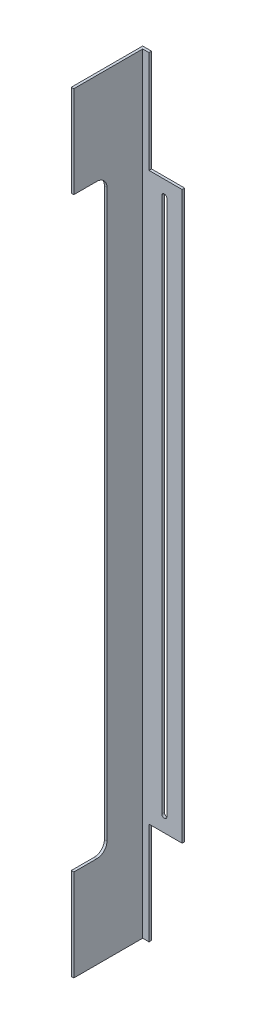
ISO-10303-21;
HEADER;
FILE_DESCRIPTION(('STEP AP214'),'2;1');
FILE_NAME('part.step','',(''),(''),'','','');
FILE_SCHEMA(('AUTOMOTIVE_DESIGN { 1 0 10303 214 1 1 1 1 }'));
ENDSEC;
DATA;
#1=APPLICATION_CONTEXT('core data for automotive mechanical design processes');
#2=APPLICATION_PROTOCOL_DEFINITION('international standard','automotive_design',2000,#1);
#3=PRODUCT_CONTEXT('',#1,'mechanical');
#4=PRODUCT('Part','Part','',(#3));
#5=PRODUCT_RELATED_PRODUCT_CATEGORY('part','',(#4));
#6=PRODUCT_DEFINITION_FORMATION('','',#4);
#7=PRODUCT_DEFINITION_CONTEXT('part definition',#1,'design');
#8=PRODUCT_DEFINITION('design','',#6,#7);
#9=PRODUCT_DEFINITION_SHAPE('','',#8);
#10=(LENGTH_UNIT() NAMED_UNIT(*) SI_UNIT(.MILLI.,.METRE.));
#11=(NAMED_UNIT(*) PLANE_ANGLE_UNIT() SI_UNIT($,.RADIAN.));
#12=(NAMED_UNIT(*) SI_UNIT($,.STERADIAN.) SOLID_ANGLE_UNIT());
#13=UNCERTAINTY_MEASURE_WITH_UNIT(LENGTH_MEASURE(1.E-05),#10,'distance_accuracy_value','');
#14=(GEOMETRIC_REPRESENTATION_CONTEXT(3) GLOBAL_UNCERTAINTY_ASSIGNED_CONTEXT((#13)) GLOBAL_UNIT_ASSIGNED_CONTEXT((#10,
#11,#12)) REPRESENTATION_CONTEXT('',''));
#15=CARTESIAN_POINT('',(0.,0.,0.));
#16=DIRECTION('',(0.,0.,1.));
#17=DIRECTION('',(1.,0.,0.));
#18=AXIS2_PLACEMENT_3D('',#15,#16,#17);
#19=CARTESIAN_POINT('',(3.50000000000001,262.,1.));
#20=DIRECTION('',(0.,0.,1.));
#21=DIRECTION('',(1.,0.,0.));
#22=AXIS2_PLACEMENT_3D('',#19,#20,#21);
#23=PLANE('',#22);
#24=DIRECTION('',(0.,1.,0.));
#25=VECTOR('',#24,1.);
#26=CARTESIAN_POINT('',(1.00000000000002,262.,1.));
#27=LINE('',#26,#25);
#28=CARTESIAN_POINT('',(0.999999999999997,-40.,1.));
#29=VERTEX_POINT('',#28);
#30=CARTESIAN_POINT('',(1.00000000000002,262.,1.));
#31=VERTEX_POINT('',#30);
#32=EDGE_CURVE('E234',#29,#31,#27,.T.);
#33=ORIENTED_EDGE('',*,*,#32,.F.);
#34=DIRECTION('',(1.,0.,0.));
#35=VECTOR('',#34,1.);
#36=CARTESIAN_POINT('',(3.50000000000001,-40.,1.));
#37=LINE('',#36,#35);
#38=CARTESIAN_POINT('',(3.50000000000001,-40.,1.));
#39=VERTEX_POINT('',#38);
#40=EDGE_CURVE('E189',#29,#39,#37,.T.);
#41=ORIENTED_EDGE('',*,*,#40,.T.);
#42=DIRECTION('',(0.,1.,0.));
#43=VECTOR('',#42,1.);
#44=CARTESIAN_POINT('',(3.5,0.,1.));
#45=LINE('',#44,#43);
#46=CARTESIAN_POINT('',(3.5,0.,1.));
#47=VERTEX_POINT('',#46);
#48=EDGE_CURVE('E262',#39,#47,#45,.T.);
#49=ORIENTED_EDGE('',*,*,#48,.T.);
#50=DIRECTION('',(1.,0.,0.));
#51=VECTOR('',#50,1.);
#52=CARTESIAN_POINT('',(3.5,0.,1.));
#53=LINE('',#52,#51);
#54=CARTESIAN_POINT('',(16.5,0.,1.));
#55=VERTEX_POINT('',#54);
#56=EDGE_CURVE('E264',#47,#55,#53,.T.);
#57=ORIENTED_EDGE('',*,*,#56,.T.);
#58=DIRECTION('',(0.,1.,0.));
#59=VECTOR('',#58,1.);
#60=CARTESIAN_POINT('',(16.5,0.,1.));
#61=LINE('',#60,#59);
#62=CARTESIAN_POINT('',(16.5,222.,1.));
#63=VERTEX_POINT('',#62);
#64=EDGE_CURVE('E266',#55,#63,#61,.T.);
#65=ORIENTED_EDGE('',*,*,#64,.T.);
#66=DIRECTION('',(-1.,0.,0.));
#67=VECTOR('',#66,1.);
#68=CARTESIAN_POINT('',(3.5,222.,1.));
#69=LINE('',#68,#67);
#70=CARTESIAN_POINT('',(3.5,222.,1.));
#71=VERTEX_POINT('',#70);
#72=EDGE_CURVE('E268',#63,#71,#69,.T.);
#73=ORIENTED_EDGE('',*,*,#72,.T.);
#74=DIRECTION('',(0.,1.,0.));
#75=VECTOR('',#74,1.);
#76=CARTESIAN_POINT('',(3.5,222.,1.));
#77=LINE('',#76,#75);
#78=CARTESIAN_POINT('',(3.50000000000001,262.,1.));
#79=VERTEX_POINT('',#78);
#80=EDGE_CURVE('E255',#71,#79,#77,.T.);
#81=ORIENTED_EDGE('',*,*,#80,.T.);
#82=DIRECTION('',(-1.,0.,0.));
#83=VECTOR('',#82,1.);
#84=CARTESIAN_POINT('',(3.50000000000001,262.,1.));
#85=LINE('',#84,#83);
#86=EDGE_CURVE('E258',#79,#31,#85,.T.);
#87=ORIENTED_EDGE('',*,*,#86,.T.);
#88=EDGE_LOOP('',(#33,#41,#49,#57,#65,#73,#81,#87));
#89=FACE_BOUND('',#88,.T.);
#90=DIRECTION('',(0.,-1.,0.));
#91=VECTOR('',#90,1.);
#92=CARTESIAN_POINT('',(8.5,217.,1.));
#93=LINE('',#92,#91);
#94=CARTESIAN_POINT('',(8.5,216.,1.));
#95=VERTEX_POINT('',#94);
#96=CARTESIAN_POINT('',(8.50000000000003,6.00000000000001,1.));
#97=VERTEX_POINT('',#96);
#98=EDGE_CURVE('E244',#95,#97,#93,.T.);
#99=ORIENTED_EDGE('',*,*,#98,.F.);
#100=CARTESIAN_POINT('',(9.5,216.,1.));
#101=DIRECTION('',(0.,0.,1.));
#102=DIRECTION('',(1.,0.,0.));
#103=AXIS2_PLACEMENT_3D('',#100,#101,#102);
#104=CIRCLE('',#103,1.);
#105=CARTESIAN_POINT('',(9.5,217.,1.));
#106=VERTEX_POINT('',#105);
#107=EDGE_CURVE('E332',#95,#106,#104,.F.);
#108=ORIENTED_EDGE('',*,*,#107,.T.);
#109=CARTESIAN_POINT('',(9.5,216.,1.));
#110=DIRECTION('',(0.,0.,1.));
#111=DIRECTION('',(1.,0.,0.));
#112=AXIS2_PLACEMENT_3D('',#109,#110,#111);
#113=CIRCLE('',#112,1.);
#114=CARTESIAN_POINT('',(10.5,216.,1.));
#115=VERTEX_POINT('',#114);
#116=EDGE_CURVE('E328',#106,#115,#113,.F.);
#117=ORIENTED_EDGE('',*,*,#116,.T.);
#118=DIRECTION('',(0.,1.,0.));
#119=VECTOR('',#118,1.);
#120=CARTESIAN_POINT('',(10.5,217.,1.));
#121=LINE('',#120,#119);
#122=CARTESIAN_POINT('',(10.5,6.00000000000001,1.));
#123=VERTEX_POINT('',#122);
#124=EDGE_CURVE('E241',#123,#115,#121,.T.);
#125=ORIENTED_EDGE('',*,*,#124,.F.);
#126=CARTESIAN_POINT('',(9.50000000000003,6.00000000000001,1.));
#127=DIRECTION('',(0.,0.,1.));
#128=DIRECTION('',(1.,0.,0.));
#129=AXIS2_PLACEMENT_3D('',#126,#127,#128);
#130=CIRCLE('',#129,1.);
#131=CARTESIAN_POINT('',(9.50000000000003,5.00000000000001,1.));
#132=VERTEX_POINT('',#131);
#133=EDGE_CURVE('E324',#123,#132,#130,.F.);
#134=ORIENTED_EDGE('',*,*,#133,.T.);
#135=CARTESIAN_POINT('',(9.50000000000003,6.00000000000001,1.));
#136=DIRECTION('',(0.,0.,1.));
#137=DIRECTION('',(1.,0.,0.));
#138=AXIS2_PLACEMENT_3D('',#135,#136,#137);
#139=CIRCLE('',#138,1.);
#140=EDGE_CURVE('E320',#132,#97,#139,.F.);
#141=ORIENTED_EDGE('',*,*,#140,.T.);
#142=EDGE_LOOP('',(#99,#108,#117,#125,#134,#141));
#143=FACE_BOUND('',#142,.T.);
#144=ADVANCED_FACE('F34',(#89,#143),#23,.T.);
#145=CARTESIAN_POINT('',(3.50000000000001,262.,0.));
#146=DIRECTION('',(0.,0.,1.));
#147=DIRECTION('',(1.,0.,0.));
#148=AXIS2_PLACEMENT_3D('',#145,#146,#147);
#149=PLANE('',#148);
#150=DIRECTION('',(0.,1.,0.));
#151=VECTOR('',#150,1.);
#152=CARTESIAN_POINT('',(3.5,0.,0.));
#153=LINE('',#152,#151);
#154=CARTESIAN_POINT('',(3.50000000000001,-40.,0.));
#155=VERTEX_POINT('',#154);
#156=CARTESIAN_POINT('',(3.5,0.,0.));
#157=VERTEX_POINT('',#156);
#158=EDGE_CURVE('E279',#155,#157,#153,.T.);
#159=ORIENTED_EDGE('',*,*,#158,.F.);
#160=DIRECTION('',(1.,0.,0.));
#161=VECTOR('',#160,1.);
#162=CARTESIAN_POINT('',(3.50000000000001,-40.,0.));
#163=LINE('',#162,#161);
#164=CARTESIAN_POINT('',(0.,-40.,0.));
#165=VERTEX_POINT('',#164);
#166=EDGE_CURVE('E277',#165,#155,#163,.T.);
#167=ORIENTED_EDGE('',*,*,#166,.F.);
#168=DIRECTION('',(0.,-1.,0.));
#169=VECTOR('',#168,1.);
#170=CARTESIAN_POINT('',(0.,0.,0.));
#171=LINE('',#170,#169);
#172=CARTESIAN_POINT('',(0.,262.,0.));
#173=VERTEX_POINT('',#172);
#174=EDGE_CURVE('E275',#173,#165,#171,.T.);
#175=ORIENTED_EDGE('',*,*,#174,.F.);
#176=DIRECTION('',(-1.,0.,0.));
#177=VECTOR('',#176,1.);
#178=CARTESIAN_POINT('',(3.50000000000001,262.,0.));
#179=LINE('',#178,#177);
#180=CARTESIAN_POINT('',(3.50000000000001,262.,0.));
#181=VERTEX_POINT('',#180);
#182=EDGE_CURVE('E273',#181,#173,#179,.T.);
#183=ORIENTED_EDGE('',*,*,#182,.F.);
#184=DIRECTION('',(0.,1.,0.));
#185=VECTOR('',#184,1.);
#186=CARTESIAN_POINT('',(3.5,222.,0.));
#187=LINE('',#186,#185);
#188=CARTESIAN_POINT('',(3.5,222.,0.));
#189=VERTEX_POINT('',#188);
#190=EDGE_CURVE('E248',#189,#181,#187,.T.);
#191=ORIENTED_EDGE('',*,*,#190,.F.);
#192=DIRECTION('',(-1.,0.,0.));
#193=VECTOR('',#192,1.);
#194=CARTESIAN_POINT('',(3.5,222.,0.));
#195=LINE('',#194,#193);
#196=CARTESIAN_POINT('',(16.5,222.,0.));
#197=VERTEX_POINT('',#196);
#198=EDGE_CURVE('E259',#197,#189,#195,.T.);
#199=ORIENTED_EDGE('',*,*,#198,.F.);
#200=DIRECTION('',(0.,1.,0.));
#201=VECTOR('',#200,1.);
#202=CARTESIAN_POINT('',(16.5,0.,0.));
#203=LINE('',#202,#201);
#204=CARTESIAN_POINT('',(16.5,0.,0.));
#205=VERTEX_POINT('',#204);
#206=EDGE_CURVE('E283',#205,#197,#203,.T.);
#207=ORIENTED_EDGE('',*,*,#206,.F.);
#208=DIRECTION('',(1.,0.,0.));
#209=VECTOR('',#208,1.);
#210=CARTESIAN_POINT('',(3.5,0.,0.));
#211=LINE('',#210,#209);
#212=EDGE_CURVE('E281',#157,#205,#211,.T.);
#213=ORIENTED_EDGE('',*,*,#212,.F.);
#214=EDGE_LOOP('',(#159,#167,#175,#183,#191,#199,#207,#213));
#215=FACE_BOUND('',#214,.T.);
#216=CARTESIAN_POINT('',(9.50000000000003,6.00000000000001,0.));
#217=DIRECTION('',(0.,0.,1.));
#218=DIRECTION('',(1.,0.,0.));
#219=AXIS2_PLACEMENT_3D('',#216,#217,#218);
#220=CIRCLE('',#219,1.);
#221=CARTESIAN_POINT('',(8.50000000000003,6.00000000000001,0.));
#222=VERTEX_POINT('',#221);
#223=CARTESIAN_POINT('',(9.50000000000003,5.00000000000001,0.));
#224=VERTEX_POINT('',#223);
#225=EDGE_CURVE('E318',#222,#224,#220,.T.);
#226=ORIENTED_EDGE('',*,*,#225,.T.);
#227=CARTESIAN_POINT('',(9.50000000000003,6.00000000000001,0.));
#228=DIRECTION('',(0.,0.,1.));
#229=DIRECTION('',(1.,0.,0.));
#230=AXIS2_PLACEMENT_3D('',#227,#228,#229);
#231=CIRCLE('',#230,1.);
#232=CARTESIAN_POINT('',(10.5,6.00000000000001,0.));
#233=VERTEX_POINT('',#232);
#234=EDGE_CURVE('E322',#224,#233,#231,.T.);
#235=ORIENTED_EDGE('',*,*,#234,.T.);
#236=DIRECTION('',(0.,1.,0.));
#237=VECTOR('',#236,1.);
#238=CARTESIAN_POINT('',(10.5,217.,0.));
#239=LINE('',#238,#237);
#240=CARTESIAN_POINT('',(10.5,216.,0.));
#241=VERTEX_POINT('',#240);
#242=EDGE_CURVE('E249',#233,#241,#239,.T.);
#243=ORIENTED_EDGE('',*,*,#242,.T.);
#244=CARTESIAN_POINT('',(9.5,216.,0.));
#245=DIRECTION('',(0.,0.,1.));
#246=DIRECTION('',(1.,0.,0.));
#247=AXIS2_PLACEMENT_3D('',#244,#245,#246);
#248=CIRCLE('',#247,1.);
#249=CARTESIAN_POINT('',(9.5,217.,0.));
#250=VERTEX_POINT('',#249);
#251=EDGE_CURVE('E326',#241,#250,#248,.T.);
#252=ORIENTED_EDGE('',*,*,#251,.T.);
#253=CARTESIAN_POINT('',(9.5,216.,0.));
#254=DIRECTION('',(0.,0.,1.));
#255=DIRECTION('',(1.,0.,0.));
#256=AXIS2_PLACEMENT_3D('',#253,#254,#255);
#257=CIRCLE('',#256,1.);
#258=CARTESIAN_POINT('',(8.5,216.,0.));
#259=VERTEX_POINT('',#258);
#260=EDGE_CURVE('E330',#250,#259,#257,.T.);
#261=ORIENTED_EDGE('',*,*,#260,.T.);
#262=DIRECTION('',(0.,-1.,0.));
#263=VECTOR('',#262,1.);
#264=CARTESIAN_POINT('',(8.5,217.,0.));
#265=LINE('',#264,#263);
#266=EDGE_CURVE('E245',#259,#222,#265,.T.);
#267=ORIENTED_EDGE('',*,*,#266,.T.);
#268=EDGE_LOOP('',(#226,#235,#243,#252,#261,#267));
#269=FACE_BOUND('',#268,.T.);
#270=ADVANCED_FACE('F381',(#215,#269),#149,.F.);
#271=CARTESIAN_POINT('',(3.5,222.,1.));
#272=DIRECTION('',(-1.,0.,0.));
#273=DIRECTION('',(0.,-1.,0.));
#274=AXIS2_PLACEMENT_3D('',#271,#272,#273);
#275=PLANE('',#274);
#276=ORIENTED_EDGE('',*,*,#190,.T.);
#277=DIRECTION('',(0.,0.,-1.));
#278=VECTOR('',#277,1.);
#279=CARTESIAN_POINT('',(3.50000000000001,262.,1.));
#280=LINE('',#279,#278);
#281=EDGE_CURVE('E305',#79,#181,#280,.T.);
#282=ORIENTED_EDGE('',*,*,#281,.F.);
#283=ORIENTED_EDGE('',*,*,#80,.F.);
#284=DIRECTION('',(0.,0.,-1.));
#285=VECTOR('',#284,1.);
#286=CARTESIAN_POINT('',(3.5,222.,1.));
#287=LINE('',#286,#285);
#288=EDGE_CURVE('E270',#71,#189,#287,.T.);
#289=ORIENTED_EDGE('',*,*,#288,.T.);
#290=EDGE_LOOP('',(#276,#282,#283,#289));
#291=FACE_BOUND('',#290,.T.);
#292=ADVANCED_FACE('F396',(#291),#275,.F.);
#293=CARTESIAN_POINT('',(3.50000000000001,262.,1.));
#294=DIRECTION('',(0.,-1.,0.));
#295=DIRECTION('',(0.,0.,-1.));
#296=AXIS2_PLACEMENT_3D('',#293,#294,#295);
#297=PLANE('',#296);
#298=ORIENTED_EDGE('',*,*,#182,.T.);
#299=DIRECTION('',(0.,0.,-1.));
#300=VECTOR('',#299,1.);
#301=CARTESIAN_POINT('',(0.,262.,1.));
#302=LINE('',#301,#300);
#303=CARTESIAN_POINT('',(0.,262.,28.));
#304=VERTEX_POINT('',#303);
#305=EDGE_CURVE('E302',#304,#173,#302,.T.);
#306=ORIENTED_EDGE('',*,*,#305,.F.);
#307=DIRECTION('',(-1.,0.,0.));
#308=VECTOR('',#307,1.);
#309=CARTESIAN_POINT('',(1.00000000000002,262.,28.));
#310=LINE('',#309,#308);
#311=CARTESIAN_POINT('',(1.00000000000002,262.,28.));
#312=VERTEX_POINT('',#311);
#313=EDGE_CURVE('E231',#312,#304,#310,.T.);
#314=ORIENTED_EDGE('',*,*,#313,.F.);
#315=DIRECTION('',(0.,0.,-1.));
#316=VECTOR('',#315,1.);
#317=CARTESIAN_POINT('',(1.00000000000002,262.,0.));
#318=LINE('',#317,#316);
#319=EDGE_CURVE('E202',#312,#31,#318,.T.);
#320=ORIENTED_EDGE('',*,*,#319,.T.);
#321=ORIENTED_EDGE('',*,*,#86,.F.);
#322=ORIENTED_EDGE('',*,*,#281,.T.);
#323=EDGE_LOOP('',(#298,#306,#314,#320,#321,#322));
#324=FACE_BOUND('',#323,.T.);
#325=ADVANCED_FACE('F375',(#324),#297,.F.);
#326=CARTESIAN_POINT('',(0.,0.,1.));
#327=DIRECTION('',(1.,0.,0.));
#328=DIRECTION('',(0.,1.,0.));
#329=AXIS2_PLACEMENT_3D('',#326,#327,#328);
#330=PLANE('',#329);
#331=ORIENTED_EDGE('',*,*,#174,.T.);
#332=DIRECTION('',(0.,0.,-1.));
#333=VECTOR('',#332,1.);
#334=CARTESIAN_POINT('',(0.,-40.,1.));
#335=LINE('',#334,#333);
#336=CARTESIAN_POINT('',(0.,-40.,28.));
#337=VERTEX_POINT('',#336);
#338=EDGE_CURVE('E300',#337,#165,#335,.T.);
#339=ORIENTED_EDGE('',*,*,#338,.F.);
#340=DIRECTION('',(0.,1.,0.));
#341=VECTOR('',#340,1.);
#342=CARTESIAN_POINT('',(0.,-40.,28.));
#343=LINE('',#342,#341);
#344=CARTESIAN_POINT('',(0.,-4.00000000000001,28.));
#345=VERTEX_POINT('',#344);
#346=EDGE_CURVE('E200',#337,#345,#343,.T.);
#347=ORIENTED_EDGE('',*,*,#346,.T.);
#348=DIRECTION('',(0.,0.,-1.));
#349=VECTOR('',#348,1.);
#350=CARTESIAN_POINT('',(0.,-4.00000000000001,28.));
#351=LINE('',#350,#349);
#352=CARTESIAN_POINT('',(0.,-4.00000000000001,19.));
#353=VERTEX_POINT('',#352);
#354=EDGE_CURVE('E222',#345,#353,#351,.T.);
#355=ORIENTED_EDGE('',*,*,#354,.T.);
#356=CARTESIAN_POINT('',(0.,0.,19.));
#357=DIRECTION('',(1.,0.,0.));
#358=DIRECTION('',(0.,1.,0.));
#359=AXIS2_PLACEMENT_3D('',#356,#357,#358);
#360=CIRCLE('',#359,4.);
#361=CARTESIAN_POINT('',(0.,0.,15.));
#362=VERTEX_POINT('',#361);
#363=EDGE_CURVE('E347',#353,#362,#360,.T.);
#364=ORIENTED_EDGE('',*,*,#363,.T.);
#365=DIRECTION('',(0.,1.,0.));
#366=VECTOR('',#365,1.);
#367=CARTESIAN_POINT('',(0.,226.,15.));
#368=LINE('',#367,#366);
#369=CARTESIAN_POINT('',(0.,222.,15.));
#370=VERTEX_POINT('',#369);
#371=EDGE_CURVE('E225',#362,#370,#368,.T.);
#372=ORIENTED_EDGE('',*,*,#371,.T.);
#373=CARTESIAN_POINT('',(0.,222.,19.));
#374=DIRECTION('',(1.,0.,0.));
#375=DIRECTION('',(0.,1.,0.));
#376=AXIS2_PLACEMENT_3D('',#373,#374,#375);
#377=CIRCLE('',#376,4.);
#378=CARTESIAN_POINT('',(0.,226.,19.));
#379=VERTEX_POINT('',#378);
#380=EDGE_CURVE('E42',#370,#379,#377,.T.);
#381=ORIENTED_EDGE('',*,*,#380,.T.);
#382=DIRECTION('',(0.,0.,1.));
#383=VECTOR('',#382,1.);
#384=CARTESIAN_POINT('',(0.,226.,28.));
#385=LINE('',#384,#383);
#386=CARTESIAN_POINT('',(0.,226.,28.));
#387=VERTEX_POINT('',#386);
#388=EDGE_CURVE('E227',#379,#387,#385,.T.);
#389=ORIENTED_EDGE('',*,*,#388,.T.);
#390=DIRECTION('',(0.,1.,0.));
#391=VECTOR('',#390,1.);
#392=CARTESIAN_POINT('',(0.,226.,28.));
#393=LINE('',#392,#391);
#394=EDGE_CURVE('E194',#387,#304,#393,.T.);
#395=ORIENTED_EDGE('',*,*,#394,.T.);
#396=ORIENTED_EDGE('',*,*,#305,.T.);
#397=EDGE_LOOP('',(#331,#339,#347,#355,#364,#372,#381,#389,#395,#396));
#398=FACE_BOUND('',#397,.T.);
#399=ADVANCED_FACE('F360',(#398),#330,.F.);
#400=CARTESIAN_POINT('',(3.50000000000001,-40.,1.));
#401=DIRECTION('',(0.,1.,0.));
#402=DIRECTION('',(0.,0.,1.));
#403=AXIS2_PLACEMENT_3D('',#400,#401,#402);
#404=PLANE('',#403);
#405=ORIENTED_EDGE('',*,*,#40,.F.);
#406=DIRECTION('',(0.,0.,1.));
#407=VECTOR('',#406,1.);
#408=CARTESIAN_POINT('',(0.999999999999997,-40.,0.));
#409=LINE('',#408,#407);
#410=CARTESIAN_POINT('',(0.999999999999997,-40.,28.));
#411=VERTEX_POINT('',#410);
#412=EDGE_CURVE('E182',#29,#411,#409,.T.);
#413=ORIENTED_EDGE('',*,*,#412,.T.);
#414=DIRECTION('',(-1.,0.,0.));
#415=VECTOR('',#414,1.);
#416=CARTESIAN_POINT('',(0.999999999999997,-40.,28.));
#417=LINE('',#416,#415);
#418=EDGE_CURVE('E186',#411,#337,#417,.T.);
#419=ORIENTED_EDGE('',*,*,#418,.T.);
#420=ORIENTED_EDGE('',*,*,#338,.T.);
#421=ORIENTED_EDGE('',*,*,#166,.T.);
#422=DIRECTION('',(0.,0.,-1.));
#423=VECTOR('',#422,1.);
#424=CARTESIAN_POINT('',(3.50000000000001,-40.,1.));
#425=LINE('',#424,#423);
#426=EDGE_CURVE('E297',#39,#155,#425,.T.);
#427=ORIENTED_EDGE('',*,*,#426,.F.);
#428=EDGE_LOOP('',(#405,#413,#419,#420,#421,#427));
#429=FACE_BOUND('',#428,.T.);
#430=ADVANCED_FACE('F184',(#429),#404,.F.);
#431=CARTESIAN_POINT('',(3.5,0.,1.));
#432=DIRECTION('',(-1.,0.,0.));
#433=DIRECTION('',(0.,-1.,0.));
#434=AXIS2_PLACEMENT_3D('',#431,#432,#433);
#435=PLANE('',#434);
#436=ORIENTED_EDGE('',*,*,#158,.T.);
#437=DIRECTION('',(0.,0.,-1.));
#438=VECTOR('',#437,1.);
#439=CARTESIAN_POINT('',(3.5,0.,1.));
#440=LINE('',#439,#438);
#441=EDGE_CURVE('E294',#47,#157,#440,.T.);
#442=ORIENTED_EDGE('',*,*,#441,.F.);
#443=ORIENTED_EDGE('',*,*,#48,.F.);
#444=ORIENTED_EDGE('',*,*,#426,.T.);
#445=EDGE_LOOP('',(#436,#442,#443,#444));
#446=FACE_BOUND('',#445,.T.);
#447=ADVANCED_FACE('F386',(#446),#435,.F.);
#448=CARTESIAN_POINT('',(3.5,0.,1.));
#449=DIRECTION('',(0.,1.,0.));
#450=DIRECTION('',(-1.,0.,0.));
#451=AXIS2_PLACEMENT_3D('',#448,#449,#450);
#452=PLANE('',#451);
#453=ORIENTED_EDGE('',*,*,#212,.T.);
#454=DIRECTION('',(0.,0.,-1.));
#455=VECTOR('',#454,1.);
#456=CARTESIAN_POINT('',(16.5,0.,1.));
#457=LINE('',#456,#455);
#458=EDGE_CURVE('E291',#55,#205,#457,.T.);
#459=ORIENTED_EDGE('',*,*,#458,.F.);
#460=ORIENTED_EDGE('',*,*,#56,.F.);
#461=ORIENTED_EDGE('',*,*,#441,.T.);
#462=EDGE_LOOP('',(#453,#459,#460,#461));
#463=FACE_BOUND('',#462,.T.);
#464=ADVANCED_FACE('F406',(#463),#452,.F.);
#465=CARTESIAN_POINT('',(16.5,0.,1.));
#466=DIRECTION('',(-1.,0.,0.));
#467=DIRECTION('',(0.,-1.,0.));
#468=AXIS2_PLACEMENT_3D('',#465,#466,#467);
#469=PLANE('',#468);
#470=ORIENTED_EDGE('',*,*,#206,.T.);
#471=DIRECTION('',(0.,0.,-1.));
#472=VECTOR('',#471,1.);
#473=CARTESIAN_POINT('',(16.5,222.,1.));
#474=LINE('',#473,#472);
#475=EDGE_CURVE('E288',#63,#197,#474,.T.);
#476=ORIENTED_EDGE('',*,*,#475,.F.);
#477=ORIENTED_EDGE('',*,*,#64,.F.);
#478=ORIENTED_EDGE('',*,*,#458,.T.);
#479=EDGE_LOOP('',(#470,#476,#477,#478));
#480=FACE_BOUND('',#479,.T.);
#481=ADVANCED_FACE('F404',(#480),#469,.F.);
#482=CARTESIAN_POINT('',(3.5,222.,1.));
#483=DIRECTION('',(0.,-1.,0.));
#484=DIRECTION('',(0.,0.,-1.));
#485=AXIS2_PLACEMENT_3D('',#482,#483,#484);
#486=PLANE('',#485);
#487=ORIENTED_EDGE('',*,*,#198,.T.);
#488=ORIENTED_EDGE('',*,*,#288,.F.);
#489=ORIENTED_EDGE('',*,*,#72,.F.);
#490=ORIENTED_EDGE('',*,*,#475,.T.);
#491=EDGE_LOOP('',(#487,#488,#489,#490));
#492=FACE_BOUND('',#491,.T.);
#493=ADVANCED_FACE('F400',(#492),#486,.F.);
#494=CARTESIAN_POINT('',(10.5,217.,1.));
#495=DIRECTION('',(-1.,0.,0.));
#496=DIRECTION('',(0.,-1.,0.));
#497=AXIS2_PLACEMENT_3D('',#494,#495,#496);
#498=PLANE('',#497);
#499=ORIENTED_EDGE('',*,*,#242,.F.);
#500=DIRECTION('',(0.,0.,-1.));
#501=VECTOR('',#500,1.);
#502=CARTESIAN_POINT('',(10.5,6.00000000000001,1.));
#503=LINE('',#502,#501);
#504=EDGE_CURVE('E316',#233,#123,#503,.F.);
#505=ORIENTED_EDGE('',*,*,#504,.T.);
#506=ORIENTED_EDGE('',*,*,#124,.T.);
#507=DIRECTION('',(0.,0.,-1.));
#508=VECTOR('',#507,1.);
#509=CARTESIAN_POINT('',(10.5,216.,0.));
#510=LINE('',#509,#508);
#511=EDGE_CURVE('E313',#115,#241,#510,.T.);
#512=ORIENTED_EDGE('',*,*,#511,.T.);
#513=EDGE_LOOP('',(#499,#505,#506,#512));
#514=FACE_BOUND('',#513,.T.);
#515=ADVANCED_FACE('F422',(#514),#498,.T.);
#516=CARTESIAN_POINT('',(8.5,217.,1.));
#517=DIRECTION('',(1.,0.,0.));
#518=DIRECTION('',(0.,1.,0.));
#519=AXIS2_PLACEMENT_3D('',#516,#517,#518);
#520=PLANE('',#519);
#521=ORIENTED_EDGE('',*,*,#98,.T.);
#522=DIRECTION('',(0.,0.,-1.));
#523=VECTOR('',#522,1.);
#524=CARTESIAN_POINT('',(8.50000000000003,6.00000000000001,0.));
#525=LINE('',#524,#523);
#526=EDGE_CURVE('E310',#97,#222,#525,.T.);
#527=ORIENTED_EDGE('',*,*,#526,.T.);
#528=ORIENTED_EDGE('',*,*,#266,.F.);
#529=DIRECTION('',(0.,0.,-1.));
#530=VECTOR('',#529,1.);
#531=CARTESIAN_POINT('',(8.5,216.,1.));
#532=LINE('',#531,#530);
#533=EDGE_CURVE('E308',#259,#95,#532,.F.);
#534=ORIENTED_EDGE('',*,*,#533,.T.);
#535=EDGE_LOOP('',(#521,#527,#528,#534));
#536=FACE_BOUND('',#535,.T.);
#537=ADVANCED_FACE('F429',(#536),#520,.T.);
#538=CARTESIAN_POINT('',(9.50000000000003,6.00000000000001,1.));
#539=DIRECTION('',(0.,0.,1.));
#540=DIRECTION('',(1.,0.,0.));
#541=AXIS2_PLACEMENT_3D('',#538,#539,#540);
#542=CYLINDRICAL_SURFACE('',#541,1.);
#543=DIRECTION('',(0.,0.,-1.));
#544=VECTOR('',#543,1.);
#545=CARTESIAN_POINT('',(9.50000000000003,5.00000000000001,0.));
#546=LINE('',#545,#544);
#547=EDGE_CURVE('E252',#132,#224,#546,.T.);
#548=ORIENTED_EDGE('',*,*,#547,.F.);
#549=ORIENTED_EDGE('',*,*,#133,.F.);
#550=ORIENTED_EDGE('',*,*,#504,.F.);
#551=ORIENTED_EDGE('',*,*,#234,.F.);
#552=EDGE_LOOP('',(#548,#549,#550,#551));
#553=FACE_BOUND('',#552,.T.);
#554=ADVANCED_FACE('F434',(#553),#542,.F.);
#555=CARTESIAN_POINT('',(9.50000000000003,6.00000000000001,1.));
#556=DIRECTION('',(0.,0.,1.));
#557=DIRECTION('',(1.,0.,0.));
#558=AXIS2_PLACEMENT_3D('',#555,#556,#557);
#559=CYLINDRICAL_SURFACE('',#558,1.);
#560=ORIENTED_EDGE('',*,*,#140,.F.);
#561=ORIENTED_EDGE('',*,*,#547,.T.);
#562=ORIENTED_EDGE('',*,*,#225,.F.);
#563=ORIENTED_EDGE('',*,*,#526,.F.);
#564=EDGE_LOOP('',(#560,#561,#562,#563));
#565=FACE_BOUND('',#564,.T.);
#566=ADVANCED_FACE('F458',(#565),#559,.F.);
#567=CARTESIAN_POINT('',(9.5,216.,1.));
#568=DIRECTION('',(0.,0.,1.));
#569=DIRECTION('',(1.,0.,0.));
#570=AXIS2_PLACEMENT_3D('',#567,#568,#569);
#571=CYLINDRICAL_SURFACE('',#570,1.);
#572=DIRECTION('',(0.,0.,-1.));
#573=VECTOR('',#572,1.);
#574=CARTESIAN_POINT('',(9.5,217.,0.));
#575=LINE('',#574,#573);
#576=EDGE_CURVE('E240',#106,#250,#575,.T.);
#577=ORIENTED_EDGE('',*,*,#576,.F.);
#578=ORIENTED_EDGE('',*,*,#107,.F.);
#579=ORIENTED_EDGE('',*,*,#533,.F.);
#580=ORIENTED_EDGE('',*,*,#260,.F.);
#581=EDGE_LOOP('',(#577,#578,#579,#580));
#582=FACE_BOUND('',#581,.T.);
#583=ADVANCED_FACE('F454',(#582),#571,.F.);
#584=CARTESIAN_POINT('',(9.5,216.,1.));
#585=DIRECTION('',(0.,0.,1.));
#586=DIRECTION('',(1.,0.,0.));
#587=AXIS2_PLACEMENT_3D('',#584,#585,#586);
#588=CYLINDRICAL_SURFACE('',#587,1.);
#589=ORIENTED_EDGE('',*,*,#116,.F.);
#590=ORIENTED_EDGE('',*,*,#576,.T.);
#591=ORIENTED_EDGE('',*,*,#251,.F.);
#592=ORIENTED_EDGE('',*,*,#511,.F.);
#593=EDGE_LOOP('',(#589,#590,#591,#592));
#594=FACE_BOUND('',#593,.T.);
#595=ADVANCED_FACE('F448',(#594),#588,.F.);
#596=CARTESIAN_POINT('',(1.00000000000002,226.,28.));
#597=DIRECTION('',(0.,0.,1.));
#598=DIRECTION('',(1.,0.,0.));
#599=AXIS2_PLACEMENT_3D('',#596,#597,#598);
#600=PLANE('',#599);
#601=ORIENTED_EDGE('',*,*,#394,.F.);
#602=DIRECTION('',(-1.,0.,0.));
#603=VECTOR('',#602,1.);
#604=CARTESIAN_POINT('',(1.00000000000002,226.,28.));
#605=LINE('',#604,#603);
#606=CARTESIAN_POINT('',(1.00000000000002,226.,28.));
#607=VERTEX_POINT('',#606);
#608=EDGE_CURVE('E235',#607,#387,#605,.T.);
#609=ORIENTED_EDGE('',*,*,#608,.F.);
#610=DIRECTION('',(0.,1.,0.));
#611=VECTOR('',#610,1.);
#612=CARTESIAN_POINT('',(1.00000000000002,226.,28.));
#613=LINE('',#612,#611);
#614=EDGE_CURVE('E216',#607,#312,#613,.T.);
#615=ORIENTED_EDGE('',*,*,#614,.T.);
#616=ORIENTED_EDGE('',*,*,#313,.T.);
#617=EDGE_LOOP('',(#601,#609,#615,#616));
#618=FACE_BOUND('',#617,.T.);
#619=ADVANCED_FACE('F372',(#618),#600,.T.);
#620=CARTESIAN_POINT('',(1.00000000000002,226.,28.));
#621=DIRECTION('',(0.,-1.,0.));
#622=DIRECTION('',(1.,0.,0.));
#623=AXIS2_PLACEMENT_3D('',#620,#621,#622);
#624=PLANE('',#623);
#625=ORIENTED_EDGE('',*,*,#388,.F.);
#626=DIRECTION('',(-1.,0.,0.));
#627=VECTOR('',#626,1.);
#628=CARTESIAN_POINT('',(1.00000000000002,226.,19.));
#629=LINE('',#628,#627);
#630=CARTESIAN_POINT('',(1.00000000000002,226.,19.));
#631=VERTEX_POINT('',#630);
#632=EDGE_CURVE('E49',#379,#631,#629,.F.);
#633=ORIENTED_EDGE('',*,*,#632,.T.);
#634=DIRECTION('',(0.,0.,1.));
#635=VECTOR('',#634,1.);
#636=CARTESIAN_POINT('',(1.00000000000002,226.,28.));
#637=LINE('',#636,#635);
#638=EDGE_CURVE('E214',#631,#607,#637,.T.);
#639=ORIENTED_EDGE('',*,*,#638,.T.);
#640=ORIENTED_EDGE('',*,*,#608,.T.);
#641=EDGE_LOOP('',(#625,#633,#639,#640));
#642=FACE_BOUND('',#641,.T.);
#643=ADVANCED_FACE('F369',(#642),#624,.T.);
#644=CARTESIAN_POINT('',(1.00000000000002,226.,15.));
#645=DIRECTION('',(0.,0.,1.));
#646=DIRECTION('',(0.,-1.,0.));
#647=AXIS2_PLACEMENT_3D('',#644,#645,#646);
#648=PLANE('',#647);
#649=ORIENTED_EDGE('',*,*,#371,.F.);
#650=DIRECTION('',(-1.,0.,0.));
#651=VECTOR('',#650,1.);
#652=CARTESIAN_POINT('',(1.,0.,15.));
#653=LINE('',#652,#651);
#654=CARTESIAN_POINT('',(1.,0.,15.));
#655=VERTEX_POINT('',#654);
#656=EDGE_CURVE('E344',#362,#655,#653,.F.);
#657=ORIENTED_EDGE('',*,*,#656,.T.);
#658=DIRECTION('',(0.,1.,0.));
#659=VECTOR('',#658,1.);
#660=CARTESIAN_POINT('',(1.00000000000002,226.,15.));
#661=LINE('',#660,#659);
#662=CARTESIAN_POINT('',(1.00000000000002,222.,15.));
#663=VERTEX_POINT('',#662);
#664=EDGE_CURVE('E209',#655,#663,#661,.T.);
#665=ORIENTED_EDGE('',*,*,#664,.T.);
#666=DIRECTION('',(-1.,0.,0.));
#667=VECTOR('',#666,1.);
#668=CARTESIAN_POINT('',(0.,222.,15.));
#669=LINE('',#668,#667);
#670=EDGE_CURVE('E341',#663,#370,#669,.T.);
#671=ORIENTED_EDGE('',*,*,#670,.T.);
#672=EDGE_LOOP('',(#649,#657,#665,#671));
#673=FACE_BOUND('',#672,.T.);
#674=ADVANCED_FACE('F362',(#673),#648,.T.);
#675=CARTESIAN_POINT('',(1.,-4.00000000000001,28.));
#676=DIRECTION('',(0.,1.,0.));
#677=DIRECTION('',(-1.,0.,0.));
#678=AXIS2_PLACEMENT_3D('',#675,#676,#677);
#679=PLANE('',#678);
#680=DIRECTION('',(0.,0.,-1.));
#681=VECTOR('',#680,1.);
#682=CARTESIAN_POINT('',(1.,-4.00000000000001,28.));
#683=LINE('',#682,#681);
#684=CARTESIAN_POINT('',(1.,-4.00000000000001,28.));
#685=VERTEX_POINT('',#684);
#686=CARTESIAN_POINT('',(1.,-4.00000000000001,19.));
#687=VERTEX_POINT('',#686);
#688=EDGE_CURVE('E207',#685,#687,#683,.T.);
#689=ORIENTED_EDGE('',*,*,#688,.T.);
#690=DIRECTION('',(-1.,0.,0.));
#691=VECTOR('',#690,1.);
#692=CARTESIAN_POINT('',(0.,-4.00000000000001,19.));
#693=LINE('',#692,#691);
#694=EDGE_CURVE('E334',#687,#353,#693,.T.);
#695=ORIENTED_EDGE('',*,*,#694,.T.);
#696=ORIENTED_EDGE('',*,*,#354,.F.);
#697=DIRECTION('',(-1.,0.,0.));
#698=VECTOR('',#697,1.);
#699=CARTESIAN_POINT('',(1.,-4.00000000000001,28.));
#700=LINE('',#699,#698);
#701=EDGE_CURVE('E201',#685,#345,#700,.T.);
#702=ORIENTED_EDGE('',*,*,#701,.F.);
#703=EDGE_LOOP('',(#689,#695,#696,#702));
#704=FACE_BOUND('',#703,.T.);
#705=ADVANCED_FACE('F356',(#704),#679,.T.);
#706=CARTESIAN_POINT('',(0.999999999999997,-40.,28.));
#707=DIRECTION('',(0.,0.,1.));
#708=DIRECTION('',(1.,0.,0.));
#709=AXIS2_PLACEMENT_3D('',#706,#707,#708);
#710=PLANE('',#709);
#711=ORIENTED_EDGE('',*,*,#346,.F.);
#712=ORIENTED_EDGE('',*,*,#418,.F.);
#713=DIRECTION('',(0.,1.,0.));
#714=VECTOR('',#713,1.);
#715=CARTESIAN_POINT('',(0.999999999999997,-40.,28.));
#716=LINE('',#715,#714);
#717=EDGE_CURVE('E193',#411,#685,#716,.T.);
#718=ORIENTED_EDGE('',*,*,#717,.T.);
#719=ORIENTED_EDGE('',*,*,#701,.T.);
#720=EDGE_LOOP('',(#711,#712,#718,#719));
#721=FACE_BOUND('',#720,.T.);
#722=ADVANCED_FACE('F198',(#721),#710,.T.);
#723=CARTESIAN_POINT('',(1.00000000000002,262.,0.));
#724=DIRECTION('',(1.,0.,0.));
#725=DIRECTION('',(0.,1.,0.));
#726=AXIS2_PLACEMENT_3D('',#723,#724,#725);
#727=PLANE('',#726);
#728=ORIENTED_EDGE('',*,*,#412,.F.);
#729=ORIENTED_EDGE('',*,*,#32,.T.);
#730=ORIENTED_EDGE('',*,*,#319,.F.);
#731=ORIENTED_EDGE('',*,*,#614,.F.);
#732=ORIENTED_EDGE('',*,*,#638,.F.);
#733=CARTESIAN_POINT('',(1.00000000000002,222.,19.));
#734=DIRECTION('',(1.,0.,0.));
#735=DIRECTION('',(0.,1.,0.));
#736=AXIS2_PLACEMENT_3D('',#733,#734,#735);
#737=CIRCLE('',#736,4.);
#738=EDGE_CURVE('E11',#631,#663,#737,.F.);
#739=ORIENTED_EDGE('',*,*,#738,.T.);
#740=ORIENTED_EDGE('',*,*,#664,.F.);
#741=CARTESIAN_POINT('',(1.,0.,19.));
#742=DIRECTION('',(1.,0.,0.));
#743=DIRECTION('',(0.,1.,0.));
#744=AXIS2_PLACEMENT_3D('',#741,#742,#743);
#745=CIRCLE('',#744,4.);
#746=EDGE_CURVE('E349',#655,#687,#745,.F.);
#747=ORIENTED_EDGE('',*,*,#746,.T.);
#748=ORIENTED_EDGE('',*,*,#688,.F.);
#749=ORIENTED_EDGE('',*,*,#717,.F.);
#750=EDGE_LOOP('',(#728,#729,#730,#731,#732,#739,#740,#747,#748,#749));
#751=FACE_BOUND('',#750,.T.);
#752=ADVANCED_FACE('F205',(#751),#727,.T.);
#753=CARTESIAN_POINT('',(1.,0.,19.));
#754=DIRECTION('',(1.,0.,0.));
#755=DIRECTION('',(0.,1.,0.));
#756=AXIS2_PLACEMENT_3D('',#753,#754,#755);
#757=CYLINDRICAL_SURFACE('',#756,4.);
#758=ORIENTED_EDGE('',*,*,#746,.F.);
#759=ORIENTED_EDGE('',*,*,#656,.F.);
#760=ORIENTED_EDGE('',*,*,#363,.F.);
#761=ORIENTED_EDGE('',*,*,#694,.F.);
#762=EDGE_LOOP('',(#758,#759,#760,#761));
#763=FACE_BOUND('',#762,.T.);
#764=ADVANCED_FACE('F358',(#763),#757,.F.);
#765=CARTESIAN_POINT('',(1.00000000000002,222.,19.));
#766=DIRECTION('',(1.,0.,0.));
#767=DIRECTION('',(0.,1.,0.));
#768=AXIS2_PLACEMENT_3D('',#765,#766,#767);
#769=CYLINDRICAL_SURFACE('',#768,4.);
#770=ORIENTED_EDGE('',*,*,#738,.F.);
#771=ORIENTED_EDGE('',*,*,#632,.F.);
#772=ORIENTED_EDGE('',*,*,#380,.F.);
#773=ORIENTED_EDGE('',*,*,#670,.F.);
#774=EDGE_LOOP('',(#770,#771,#772,#773));
#775=FACE_BOUND('',#774,.T.);
#776=ADVANCED_FACE('F36',(#775),#769,.F.);
#777=CLOSED_SHELL('',(#144,#270,#292,#325,#399,#430,#447,#464,#481,#493,#515,#537,#554,#566,
#583,#595,#619,#643,#674,#705,#722,#752,#764,#776));
#778=MANIFOLD_SOLID_BREP('B2',#777);
#779=ADVANCED_BREP_SHAPE_REPRESENTATION('',(#18,#778),#14);
#780=SHAPE_DEFINITION_REPRESENTATION(#9,#779);
ENDSEC;
END-ISO-10303-21;
